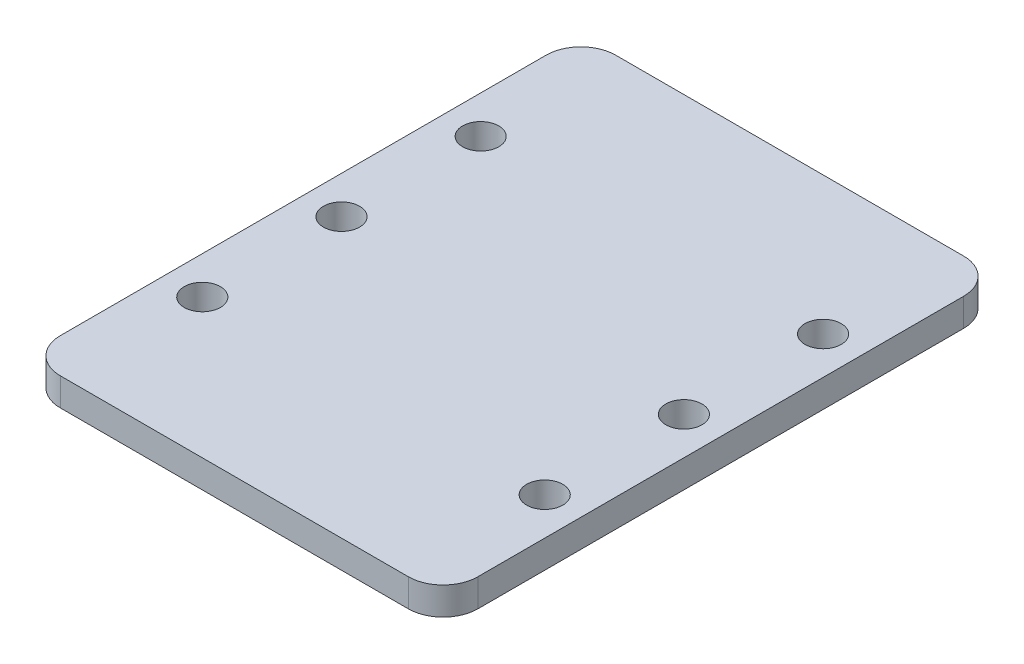
ISO-10303-21;
HEADER;
FILE_DESCRIPTION(('STEP AP214'),'2;1');
FILE_NAME('part.step','',(''),(''),'','','');
FILE_SCHEMA(('AUTOMOTIVE_DESIGN { 1 0 10303 214 1 1 1 1 }'));
ENDSEC;
DATA;
#1=APPLICATION_CONTEXT('core data for automotive mechanical design processes');
#2=APPLICATION_PROTOCOL_DEFINITION('international standard','automotive_design',2000,#1);
#3=PRODUCT_CONTEXT('',#1,'mechanical');
#4=PRODUCT('Part','Part','',(#3));
#5=PRODUCT_RELATED_PRODUCT_CATEGORY('part','',(#4));
#6=PRODUCT_DEFINITION_FORMATION('','',#4);
#7=PRODUCT_DEFINITION_CONTEXT('part definition',#1,'design');
#8=PRODUCT_DEFINITION('design','',#6,#7);
#9=PRODUCT_DEFINITION_SHAPE('','',#8);
#10=(LENGTH_UNIT() NAMED_UNIT(*) SI_UNIT(.MILLI.,.METRE.));
#11=(NAMED_UNIT(*) PLANE_ANGLE_UNIT() SI_UNIT($,.RADIAN.));
#12=(NAMED_UNIT(*) SI_UNIT($,.STERADIAN.) SOLID_ANGLE_UNIT());
#13=UNCERTAINTY_MEASURE_WITH_UNIT(LENGTH_MEASURE(1.E-05),#10,'distance_accuracy_value','');
#14=(GEOMETRIC_REPRESENTATION_CONTEXT(3) GLOBAL_UNCERTAINTY_ASSIGNED_CONTEXT((#13)) GLOBAL_UNIT_ASSIGNED_CONTEXT((#10,
#11,#12)) REPRESENTATION_CONTEXT('',''));
#15=CARTESIAN_POINT('',(0.,0.,0.));
#16=DIRECTION('',(0.,0.,1.));
#17=DIRECTION('',(1.,0.,0.));
#18=AXIS2_PLACEMENT_3D('',#15,#16,#17);
#19=CARTESIAN_POINT('',(0.,2.54,0.));
#20=DIRECTION('',(0.,-1.,0.));
#21=DIRECTION('',(0.,0.,-1.));
#22=AXIS2_PLACEMENT_3D('',#19,#20,#21);
#23=PLANE('',#22);
#24=DIRECTION('',(1.,0.,0.));
#25=VECTOR('',#24,1.);
#26=CARTESIAN_POINT('',(-76.2000000000001,2.54,-43.053));
#27=LINE('',#26,#25);
#28=CARTESIAN_POINT('',(-111.125,2.54,-43.053));
#29=VERTEX_POINT('',#28);
#30=CARTESIAN_POINT('',(-79.3750000000001,2.54,-43.053));
#31=VERTEX_POINT('',#30);
#32=EDGE_CURVE('E135',#29,#31,#27,.T.);
#33=ORIENTED_EDGE('',*,*,#32,.T.);
#34=CARTESIAN_POINT('',(-79.3750000000001,2.54,-46.228));
#35=DIRECTION('',(0.,-1.,0.));
#36=DIRECTION('',(0.,0.,-1.));
#37=AXIS2_PLACEMENT_3D('',#34,#35,#36);
#38=CIRCLE('',#37,3.175);
#39=CARTESIAN_POINT('',(-76.2000000000001,2.54,-46.228));
#40=VERTEX_POINT('',#39);
#41=EDGE_CURVE('E154',#31,#40,#38,.F.);
#42=ORIENTED_EDGE('',*,*,#41,.T.);
#43=DIRECTION('',(0.,0.,-1.));
#44=VECTOR('',#43,1.);
#45=CARTESIAN_POINT('',(-76.2000000000001,2.54,-93.726));
#46=LINE('',#45,#44);
#47=CARTESIAN_POINT('',(-76.2000000000001,2.54,-90.551));
#48=VERTEX_POINT('',#47);
#49=EDGE_CURVE('E118',#40,#48,#46,.T.);
#50=ORIENTED_EDGE('',*,*,#49,.T.);
#51=CARTESIAN_POINT('',(-79.3750000000001,2.54,-90.551));
#52=DIRECTION('',(0.,-1.,0.));
#53=DIRECTION('',(0.,0.,-1.));
#54=AXIS2_PLACEMENT_3D('',#51,#52,#53);
#55=CIRCLE('',#54,3.175);
#56=CARTESIAN_POINT('',(-79.3750000000001,2.54,-93.726));
#57=VERTEX_POINT('',#56);
#58=EDGE_CURVE('E152',#48,#57,#55,.F.);
#59=ORIENTED_EDGE('',*,*,#58,.T.);
#60=DIRECTION('',(-1.,0.,0.));
#61=VECTOR('',#60,1.);
#62=CARTESIAN_POINT('',(-76.2000000000001,2.54,-93.726));
#63=LINE('',#62,#61);
#64=CARTESIAN_POINT('',(-111.125,2.54,-93.726));
#65=VERTEX_POINT('',#64);
#66=EDGE_CURVE('E174',#57,#65,#63,.T.);
#67=ORIENTED_EDGE('',*,*,#66,.T.);
#68=CARTESIAN_POINT('',(-111.125,2.54,-90.551));
#69=DIRECTION('',(0.,-1.,0.));
#70=DIRECTION('',(0.,0.,-1.));
#71=AXIS2_PLACEMENT_3D('',#68,#69,#70);
#72=CIRCLE('',#71,3.175);
#73=CARTESIAN_POINT('',(-114.3,2.54,-90.551));
#74=VERTEX_POINT('',#73);
#75=EDGE_CURVE('E53',#65,#74,#72,.F.);
#76=ORIENTED_EDGE('',*,*,#75,.T.);
#77=DIRECTION('',(0.,0.,1.));
#78=VECTOR('',#77,1.);
#79=CARTESIAN_POINT('',(-114.3,2.54,-43.053));
#80=LINE('',#79,#78);
#81=CARTESIAN_POINT('',(-114.3,2.54,-46.228));
#82=VERTEX_POINT('',#81);
#83=EDGE_CURVE('E164',#74,#82,#80,.T.);
#84=ORIENTED_EDGE('',*,*,#83,.T.);
#85=CARTESIAN_POINT('',(-111.125,2.54,-46.228));
#86=DIRECTION('',(0.,-1.,0.));
#87=DIRECTION('',(0.,0.,-1.));
#88=AXIS2_PLACEMENT_3D('',#85,#86,#87);
#89=CIRCLE('',#88,3.175);
#90=EDGE_CURVE('E150',#82,#29,#89,.F.);
#91=ORIENTED_EDGE('',*,*,#90,.T.);
#92=EDGE_LOOP('',(#33,#42,#50,#59,#67,#76,#84,#91));
#93=FACE_BOUND('',#92,.T.);
#94=CARTESIAN_POINT('',(-110.871000000001,2.54,-81.1529999999999));
#95=DIRECTION('',(0.,1.,0.));
#96=DIRECTION('',(0.,0.,1.));
#97=AXIS2_PLACEMENT_3D('',#94,#95,#96);
#98=CIRCLE('',#97,1.65100000000001);
#99=CARTESIAN_POINT('',(-110.871000000001,2.54,-79.502));
#100=VERTEX_POINT('',#99);
#101=EDGE_CURVE('E126',#100,#100,#98,.T.);
#102=ORIENTED_EDGE('',*,*,#101,.F.);
#103=EDGE_LOOP('',(#102));
#104=FACE_BOUND('',#103,.T.);
#105=CARTESIAN_POINT('',(-110.871,2.54,-68.453));
#106=DIRECTION('',(0.,1.,0.));
#107=DIRECTION('',(0.,0.,1.));
#108=AXIS2_PLACEMENT_3D('',#105,#106,#107);
#109=CIRCLE('',#108,1.65100000000001);
#110=CARTESIAN_POINT('',(-110.871,2.54,-66.802));
#111=VERTEX_POINT('',#110);
#112=EDGE_CURVE('E179',#111,#111,#109,.T.);
#113=ORIENTED_EDGE('',*,*,#112,.F.);
#114=EDGE_LOOP('',(#113));
#115=FACE_BOUND('',#114,.T.);
#116=CARTESIAN_POINT('',(-110.871,2.54,-55.753));
#117=DIRECTION('',(0.,1.,0.));
#118=DIRECTION('',(0.,0.,1.));
#119=AXIS2_PLACEMENT_3D('',#116,#117,#118);
#120=CIRCLE('',#119,1.65100000000001);
#121=CARTESIAN_POINT('',(-110.871,2.54,-54.102));
#122=VERTEX_POINT('',#121);
#123=EDGE_CURVE('E184',#122,#122,#120,.T.);
#124=ORIENTED_EDGE('',*,*,#123,.F.);
#125=EDGE_LOOP('',(#124));
#126=FACE_BOUND('',#125,.T.);
#127=CARTESIAN_POINT('',(-79.6289999999997,2.54,-81.1529999999999));
#128=DIRECTION('',(0.,1.,0.));
#129=DIRECTION('',(0.,0.,-1.));
#130=AXIS2_PLACEMENT_3D('',#127,#128,#129);
#131=CIRCLE('',#130,1.65100000000001);
#132=CARTESIAN_POINT('',(-79.6289999999997,2.54,-82.8039999999999));
#133=VERTEX_POINT('',#132);
#134=EDGE_CURVE('E190',#133,#133,#131,.T.);
#135=ORIENTED_EDGE('',*,*,#134,.F.);
#136=EDGE_LOOP('',(#135));
#137=FACE_BOUND('',#136,.T.);
#138=CARTESIAN_POINT('',(-79.6289999999998,2.54,-68.453));
#139=DIRECTION('',(0.,1.,0.));
#140=DIRECTION('',(0.,0.,-1.));
#141=AXIS2_PLACEMENT_3D('',#138,#139,#140);
#142=CIRCLE('',#141,1.65100000000001);
#143=CARTESIAN_POINT('',(-79.6289999999998,2.54,-70.104));
#144=VERTEX_POINT('',#143);
#145=EDGE_CURVE('E196',#144,#144,#142,.T.);
#146=ORIENTED_EDGE('',*,*,#145,.F.);
#147=EDGE_LOOP('',(#146));
#148=FACE_BOUND('',#147,.T.);
#149=CARTESIAN_POINT('',(-79.629,2.54,-55.753));
#150=DIRECTION('',(0.,1.,0.));
#151=DIRECTION('',(0.,0.,-1.));
#152=AXIS2_PLACEMENT_3D('',#149,#150,#151);
#153=CIRCLE('',#152,1.65100000000001);
#154=CARTESIAN_POINT('',(-79.629,2.54,-57.404));
#155=VERTEX_POINT('',#154);
#156=EDGE_CURVE('E202',#155,#155,#153,.T.);
#157=ORIENTED_EDGE('',*,*,#156,.F.);
#158=EDGE_LOOP('',(#157));
#159=FACE_BOUND('',#158,.T.);
#160=ADVANCED_FACE('F33',(#93,#104,#115,#126,#137,#148,#159),#23,.F.);
#161=CARTESIAN_POINT('',(0.,0.,0.));
#162=DIRECTION('',(0.,-1.,0.));
#163=DIRECTION('',(0.,0.,-1.));
#164=AXIS2_PLACEMENT_3D('',#161,#162,#163);
#165=PLANE('',#164);
#166=CARTESIAN_POINT('',(-79.6289999999998,0.,-68.453));
#167=DIRECTION('',(0.,1.,0.));
#168=DIRECTION('',(0.,0.,-1.));
#169=AXIS2_PLACEMENT_3D('',#166,#167,#168);
#170=CIRCLE('',#169,1.65100000000001);
#171=CARTESIAN_POINT('',(-79.6289999999998,0.,-70.104));
#172=VERTEX_POINT('',#171);
#173=EDGE_CURVE('E199',#172,#172,#170,.T.);
#174=ORIENTED_EDGE('',*,*,#173,.T.);
#175=EDGE_LOOP('',(#174));
#176=FACE_BOUND('',#175,.T.);
#177=CARTESIAN_POINT('',(-110.871,0.,-55.753));
#178=DIRECTION('',(0.,1.,0.));
#179=DIRECTION('',(0.,0.,1.));
#180=AXIS2_PLACEMENT_3D('',#177,#178,#179);
#181=CIRCLE('',#180,1.65100000000001);
#182=CARTESIAN_POINT('',(-110.871,0.,-54.102));
#183=VERTEX_POINT('',#182);
#184=EDGE_CURVE('E187',#183,#183,#181,.T.);
#185=ORIENTED_EDGE('',*,*,#184,.T.);
#186=EDGE_LOOP('',(#185));
#187=FACE_BOUND('',#186,.T.);
#188=CARTESIAN_POINT('',(-110.871000000001,0.,-81.1529999999999));
#189=DIRECTION('',(0.,1.,0.));
#190=DIRECTION('',(0.,0.,1.));
#191=AXIS2_PLACEMENT_3D('',#188,#189,#190);
#192=CIRCLE('',#191,1.65100000000001);
#193=CARTESIAN_POINT('',(-110.871000000001,0.,-79.502));
#194=VERTEX_POINT('',#193);
#195=EDGE_CURVE('E132',#194,#194,#192,.T.);
#196=ORIENTED_EDGE('',*,*,#195,.T.);
#197=EDGE_LOOP('',(#196));
#198=FACE_BOUND('',#197,.T.);
#199=DIRECTION('',(0.,0.,-1.));
#200=VECTOR('',#199,1.);
#201=CARTESIAN_POINT('',(-76.2000000000001,0.,-93.726));
#202=LINE('',#201,#200);
#203=CARTESIAN_POINT('',(-76.2000000000001,0.,-46.228));
#204=VERTEX_POINT('',#203);
#205=CARTESIAN_POINT('',(-76.2000000000001,0.,-90.551));
#206=VERTEX_POINT('',#205);
#207=EDGE_CURVE('E115',#204,#206,#202,.T.);
#208=ORIENTED_EDGE('',*,*,#207,.F.);
#209=CARTESIAN_POINT('',(-79.3750000000001,0.,-46.228));
#210=DIRECTION('',(0.,-1.,0.));
#211=DIRECTION('',(0.,0.,-1.));
#212=AXIS2_PLACEMENT_3D('',#209,#210,#211);
#213=CIRCLE('',#212,3.175);
#214=CARTESIAN_POINT('',(-79.3750000000001,0.,-43.053));
#215=VERTEX_POINT('',#214);
#216=EDGE_CURVE('E98',#204,#215,#213,.T.);
#217=ORIENTED_EDGE('',*,*,#216,.T.);
#218=DIRECTION('',(1.,0.,0.));
#219=VECTOR('',#218,1.);
#220=CARTESIAN_POINT('',(-76.2000000000001,0.,-43.053));
#221=LINE('',#220,#219);
#222=CARTESIAN_POINT('',(-111.125,0.,-43.053));
#223=VERTEX_POINT('',#222);
#224=EDGE_CURVE('E139',#223,#215,#221,.T.);
#225=ORIENTED_EDGE('',*,*,#224,.F.);
#226=CARTESIAN_POINT('',(-111.125,0.,-46.228));
#227=DIRECTION('',(0.,-1.,0.));
#228=DIRECTION('',(0.,0.,-1.));
#229=AXIS2_PLACEMENT_3D('',#226,#227,#228);
#230=CIRCLE('',#229,3.175);
#231=CARTESIAN_POINT('',(-114.3,0.,-46.228));
#232=VERTEX_POINT('',#231);
#233=EDGE_CURVE('E143',#223,#232,#230,.T.);
#234=ORIENTED_EDGE('',*,*,#233,.T.);
#235=DIRECTION('',(0.,0.,1.));
#236=VECTOR('',#235,1.);
#237=CARTESIAN_POINT('',(-114.3,0.,-43.053));
#238=LINE('',#237,#236);
#239=CARTESIAN_POINT('',(-114.3,0.,-90.551));
#240=VERTEX_POINT('',#239);
#241=EDGE_CURVE('E129',#240,#232,#238,.T.);
#242=ORIENTED_EDGE('',*,*,#241,.F.);
#243=CARTESIAN_POINT('',(-111.125,0.,-90.551));
#244=DIRECTION('',(0.,-1.,0.));
#245=DIRECTION('',(0.,0.,-1.));
#246=AXIS2_PLACEMENT_3D('',#243,#244,#245);
#247=CIRCLE('',#246,3.175);
#248=CARTESIAN_POINT('',(-111.125,0.,-93.726));
#249=VERTEX_POINT('',#248);
#250=EDGE_CURVE('E119',#240,#249,#247,.T.);
#251=ORIENTED_EDGE('',*,*,#250,.T.);
#252=DIRECTION('',(-1.,0.,0.));
#253=VECTOR('',#252,1.);
#254=CARTESIAN_POINT('',(-76.2000000000001,0.,-93.726));
#255=LINE('',#254,#253);
#256=CARTESIAN_POINT('',(-79.3750000000001,0.,-93.726));
#257=VERTEX_POINT('',#256);
#258=EDGE_CURVE('E125',#257,#249,#255,.T.);
#259=ORIENTED_EDGE('',*,*,#258,.F.);
#260=CARTESIAN_POINT('',(-79.3750000000001,0.,-90.551));
#261=DIRECTION('',(0.,-1.,0.));
#262=DIRECTION('',(0.,0.,-1.));
#263=AXIS2_PLACEMENT_3D('',#260,#261,#262);
#264=CIRCLE('',#263,3.175);
#265=EDGE_CURVE('E109',#257,#206,#264,.T.);
#266=ORIENTED_EDGE('',*,*,#265,.T.);
#267=EDGE_LOOP('',(#208,#217,#225,#234,#242,#251,#259,#266));
#268=FACE_BOUND('',#267,.T.);
#269=CARTESIAN_POINT('',(-110.871,0.,-68.453));
#270=DIRECTION('',(0.,1.,0.));
#271=DIRECTION('',(0.,0.,1.));
#272=AXIS2_PLACEMENT_3D('',#269,#270,#271);
#273=CIRCLE('',#272,1.65100000000001);
#274=CARTESIAN_POINT('',(-110.871,0.,-66.802));
#275=VERTEX_POINT('',#274);
#276=EDGE_CURVE('E181',#275,#275,#273,.T.);
#277=ORIENTED_EDGE('',*,*,#276,.T.);
#278=EDGE_LOOP('',(#277));
#279=FACE_BOUND('',#278,.T.);
#280=CARTESIAN_POINT('',(-79.6289999999997,0.,-81.1529999999999));
#281=DIRECTION('',(0.,1.,0.));
#282=DIRECTION('',(0.,0.,-1.));
#283=AXIS2_PLACEMENT_3D('',#280,#281,#282);
#284=CIRCLE('',#283,1.65100000000001);
#285=CARTESIAN_POINT('',(-79.6289999999997,0.,-82.8039999999999));
#286=VERTEX_POINT('',#285);
#287=EDGE_CURVE('E193',#286,#286,#284,.T.);
#288=ORIENTED_EDGE('',*,*,#287,.T.);
#289=EDGE_LOOP('',(#288));
#290=FACE_BOUND('',#289,.T.);
#291=CARTESIAN_POINT('',(-79.629,0.,-55.753));
#292=DIRECTION('',(0.,1.,0.));
#293=DIRECTION('',(0.,0.,-1.));
#294=AXIS2_PLACEMENT_3D('',#291,#292,#293);
#295=CIRCLE('',#294,1.65100000000001);
#296=CARTESIAN_POINT('',(-79.629,0.,-57.404));
#297=VERTEX_POINT('',#296);
#298=EDGE_CURVE('E205',#297,#297,#295,.T.);
#299=ORIENTED_EDGE('',*,*,#298,.T.);
#300=EDGE_LOOP('',(#299));
#301=FACE_BOUND('',#300,.T.);
#302=ADVANCED_FACE('F122',(#176,#187,#198,#268,#279,#290,#301),#165,.T.);
#303=CARTESIAN_POINT('',(-76.2000000000001,2.54,-93.726));
#304=DIRECTION('',(-1.,0.,0.));
#305=DIRECTION('',(0.,0.,1.));
#306=AXIS2_PLACEMENT_3D('',#303,#304,#305);
#307=PLANE('',#306);
#308=ORIENTED_EDGE('',*,*,#49,.F.);
#309=DIRECTION('',(0.,-1.,0.));
#310=VECTOR('',#309,1.);
#311=CARTESIAN_POINT('',(-76.2000000000001,2.54,-46.228));
#312=LINE('',#311,#310);
#313=EDGE_CURVE('E102',#40,#204,#312,.T.);
#314=ORIENTED_EDGE('',*,*,#313,.T.);
#315=ORIENTED_EDGE('',*,*,#207,.T.);
#316=DIRECTION('',(0.,-1.,0.));
#317=VECTOR('',#316,1.);
#318=CARTESIAN_POINT('',(-76.2000000000001,2.54,-90.551));
#319=LINE('',#318,#317);
#320=EDGE_CURVE('E120',#206,#48,#319,.F.);
#321=ORIENTED_EDGE('',*,*,#320,.T.);
#322=EDGE_LOOP('',(#308,#314,#315,#321));
#323=FACE_BOUND('',#322,.T.);
#324=ADVANCED_FACE('F114',(#323),#307,.F.);
#325=CARTESIAN_POINT('',(-76.2000000000001,2.54,-93.726));
#326=DIRECTION('',(0.,0.,1.));
#327=DIRECTION('',(1.,0.,0.));
#328=AXIS2_PLACEMENT_3D('',#325,#326,#327);
#329=PLANE('',#328);
#330=ORIENTED_EDGE('',*,*,#66,.F.);
#331=DIRECTION('',(0.,-1.,0.));
#332=VECTOR('',#331,1.);
#333=CARTESIAN_POINT('',(-79.3750000000001,2.54,-93.726));
#334=LINE('',#333,#332);
#335=EDGE_CURVE('E158',#57,#257,#334,.T.);
#336=ORIENTED_EDGE('',*,*,#335,.T.);
#337=ORIENTED_EDGE('',*,*,#258,.T.);
#338=DIRECTION('',(0.,-1.,0.));
#339=VECTOR('',#338,1.);
#340=CARTESIAN_POINT('',(-111.125,2.54,-93.726));
#341=LINE('',#340,#339);
#342=EDGE_CURVE('E156',#249,#65,#341,.F.);
#343=ORIENTED_EDGE('',*,*,#342,.T.);
#344=EDGE_LOOP('',(#330,#336,#337,#343));
#345=FACE_BOUND('',#344,.T.);
#346=ADVANCED_FACE('F230',(#345),#329,.F.);
#347=CARTESIAN_POINT('',(-114.3,2.54,-43.053));
#348=DIRECTION('',(1.,0.,0.));
#349=DIRECTION('',(0.,0.,-1.));
#350=AXIS2_PLACEMENT_3D('',#347,#348,#349);
#351=PLANE('',#350);
#352=ORIENTED_EDGE('',*,*,#241,.T.);
#353=DIRECTION('',(0.,-1.,0.));
#354=VECTOR('',#353,1.);
#355=CARTESIAN_POINT('',(-114.3,2.54,-46.228));
#356=LINE('',#355,#354);
#357=EDGE_CURVE('E11',#232,#82,#356,.F.);
#358=ORIENTED_EDGE('',*,*,#357,.T.);
#359=ORIENTED_EDGE('',*,*,#83,.F.);
#360=DIRECTION('',(0.,-1.,0.));
#361=VECTOR('',#360,1.);
#362=CARTESIAN_POINT('',(-114.3,2.54,-90.551));
#363=LINE('',#362,#361);
#364=EDGE_CURVE('E41',#74,#240,#363,.T.);
#365=ORIENTED_EDGE('',*,*,#364,.T.);
#366=EDGE_LOOP('',(#352,#358,#359,#365));
#367=FACE_BOUND('',#366,.T.);
#368=ADVANCED_FACE('F163',(#367),#351,.F.);
#369=CARTESIAN_POINT('',(-76.2000000000001,2.54,-43.053));
#370=DIRECTION('',(0.,0.,-1.));
#371=DIRECTION('',(-1.,0.,0.));
#372=AXIS2_PLACEMENT_3D('',#369,#370,#371);
#373=PLANE('',#372);
#374=ORIENTED_EDGE('',*,*,#224,.T.);
#375=DIRECTION('',(0.,-1.,0.));
#376=VECTOR('',#375,1.);
#377=CARTESIAN_POINT('',(-79.3750000000001,2.54,-43.053));
#378=LINE('',#377,#376);
#379=EDGE_CURVE('E103',#215,#31,#378,.F.);
#380=ORIENTED_EDGE('',*,*,#379,.T.);
#381=ORIENTED_EDGE('',*,*,#32,.F.);
#382=DIRECTION('',(0.,-1.,0.));
#383=VECTOR('',#382,1.);
#384=CARTESIAN_POINT('',(-111.125,2.54,-43.053));
#385=LINE('',#384,#383);
#386=EDGE_CURVE('E108',#29,#223,#385,.T.);
#387=ORIENTED_EDGE('',*,*,#386,.T.);
#388=EDGE_LOOP('',(#374,#380,#381,#387));
#389=FACE_BOUND('',#388,.T.);
#390=ADVANCED_FACE('F172',(#389),#373,.F.);
#391=CARTESIAN_POINT('',(-110.871000000001,2.54,-81.1529999999999));
#392=DIRECTION('',(0.,-1.,0.));
#393=DIRECTION('',(0.,0.,-1.));
#394=AXIS2_PLACEMENT_3D('',#391,#392,#393);
#395=CYLINDRICAL_SURFACE('',#394,1.65100000000001);
#396=ORIENTED_EDGE('',*,*,#101,.T.);
#397=EDGE_LOOP('',(#396));
#398=FACE_BOUND('',#397,.T.);
#399=ORIENTED_EDGE('',*,*,#195,.F.);
#400=EDGE_LOOP('',(#399));
#401=FACE_BOUND('',#400,.T.);
#402=ADVANCED_FACE('F223',(#398,#401),#395,.F.);
#403=CARTESIAN_POINT('',(-110.871,2.54,-68.453));
#404=DIRECTION('',(0.,-1.,0.));
#405=DIRECTION('',(0.,0.,-1.));
#406=AXIS2_PLACEMENT_3D('',#403,#404,#405);
#407=CYLINDRICAL_SURFACE('',#406,1.65100000000001);
#408=ORIENTED_EDGE('',*,*,#112,.T.);
#409=EDGE_LOOP('',(#408));
#410=FACE_BOUND('',#409,.T.);
#411=ORIENTED_EDGE('',*,*,#276,.F.);
#412=EDGE_LOOP('',(#411));
#413=FACE_BOUND('',#412,.T.);
#414=ADVANCED_FACE('F341',(#410,#413),#407,.F.);
#415=CARTESIAN_POINT('',(-110.871,2.54,-55.753));
#416=DIRECTION('',(0.,-1.,0.));
#417=DIRECTION('',(0.,0.,-1.));
#418=AXIS2_PLACEMENT_3D('',#415,#416,#417);
#419=CYLINDRICAL_SURFACE('',#418,1.65100000000001);
#420=ORIENTED_EDGE('',*,*,#123,.T.);
#421=EDGE_LOOP('',(#420));
#422=FACE_BOUND('',#421,.T.);
#423=ORIENTED_EDGE('',*,*,#184,.F.);
#424=EDGE_LOOP('',(#423));
#425=FACE_BOUND('',#424,.T.);
#426=ADVANCED_FACE('F331',(#422,#425),#419,.F.);
#427=CARTESIAN_POINT('',(-79.6289999999997,2.54,-81.1529999999999));
#428=DIRECTION('',(0.,-1.,0.));
#429=DIRECTION('',(0.,0.,-1.));
#430=AXIS2_PLACEMENT_3D('',#427,#428,#429);
#431=CYLINDRICAL_SURFACE('',#430,1.65100000000001);
#432=ORIENTED_EDGE('',*,*,#134,.T.);
#433=EDGE_LOOP('',(#432));
#434=FACE_BOUND('',#433,.T.);
#435=ORIENTED_EDGE('',*,*,#287,.F.);
#436=EDGE_LOOP('',(#435));
#437=FACE_BOUND('',#436,.T.);
#438=ADVANCED_FACE('F321',(#434,#437),#431,.F.);
#439=CARTESIAN_POINT('',(-79.6289999999998,2.54,-68.453));
#440=DIRECTION('',(0.,-1.,0.));
#441=DIRECTION('',(0.,0.,-1.));
#442=AXIS2_PLACEMENT_3D('',#439,#440,#441);
#443=CYLINDRICAL_SURFACE('',#442,1.65100000000001);
#444=ORIENTED_EDGE('',*,*,#145,.T.);
#445=EDGE_LOOP('',(#444));
#446=FACE_BOUND('',#445,.T.);
#447=ORIENTED_EDGE('',*,*,#173,.F.);
#448=EDGE_LOOP('',(#447));
#449=FACE_BOUND('',#448,.T.);
#450=ADVANCED_FACE('F312',(#446,#449),#443,.F.);
#451=CARTESIAN_POINT('',(-79.629,2.54,-55.753));
#452=DIRECTION('',(0.,-1.,0.));
#453=DIRECTION('',(0.,0.,-1.));
#454=AXIS2_PLACEMENT_3D('',#451,#452,#453);
#455=CYLINDRICAL_SURFACE('',#454,1.65100000000001);
#456=ORIENTED_EDGE('',*,*,#156,.T.);
#457=EDGE_LOOP('',(#456));
#458=FACE_BOUND('',#457,.T.);
#459=ORIENTED_EDGE('',*,*,#298,.F.);
#460=EDGE_LOOP('',(#459));
#461=FACE_BOUND('',#460,.T.);
#462=ADVANCED_FACE('F211',(#458,#461),#455,.F.);
#463=CARTESIAN_POINT('',(-79.3750000000001,2.54,-46.228));
#464=DIRECTION('',(0.,-1.,0.));
#465=DIRECTION('',(0.,0.,-1.));
#466=AXIS2_PLACEMENT_3D('',#463,#464,#465);
#467=CYLINDRICAL_SURFACE('',#466,3.175);
#468=ORIENTED_EDGE('',*,*,#41,.F.);
#469=ORIENTED_EDGE('',*,*,#379,.F.);
#470=ORIENTED_EDGE('',*,*,#216,.F.);
#471=ORIENTED_EDGE('',*,*,#313,.F.);
#472=EDGE_LOOP('',(#468,#469,#470,#471));
#473=FACE_BOUND('',#472,.T.);
#474=ADVANCED_FACE('F101',(#473),#467,.T.);
#475=CARTESIAN_POINT('',(-79.3750000000001,2.54,-90.551));
#476=DIRECTION('',(0.,-1.,0.));
#477=DIRECTION('',(0.,0.,-1.));
#478=AXIS2_PLACEMENT_3D('',#475,#476,#477);
#479=CYLINDRICAL_SURFACE('',#478,3.175);
#480=ORIENTED_EDGE('',*,*,#58,.F.);
#481=ORIENTED_EDGE('',*,*,#320,.F.);
#482=ORIENTED_EDGE('',*,*,#265,.F.);
#483=ORIENTED_EDGE('',*,*,#335,.F.);
#484=EDGE_LOOP('',(#480,#481,#482,#483));
#485=FACE_BOUND('',#484,.T.);
#486=ADVANCED_FACE('F238',(#485),#479,.T.);
#487=CARTESIAN_POINT('',(-111.125,2.54,-46.228));
#488=DIRECTION('',(0.,-1.,0.));
#489=DIRECTION('',(0.,0.,-1.));
#490=AXIS2_PLACEMENT_3D('',#487,#488,#489);
#491=CYLINDRICAL_SURFACE('',#490,3.175);
#492=ORIENTED_EDGE('',*,*,#90,.F.);
#493=ORIENTED_EDGE('',*,*,#357,.F.);
#494=ORIENTED_EDGE('',*,*,#233,.F.);
#495=ORIENTED_EDGE('',*,*,#386,.F.);
#496=EDGE_LOOP('',(#492,#493,#494,#495));
#497=FACE_BOUND('',#496,.T.);
#498=ADVANCED_FACE('F169',(#497),#491,.T.);
#499=CARTESIAN_POINT('',(-111.125,2.54,-90.551));
#500=DIRECTION('',(0.,-1.,0.));
#501=DIRECTION('',(0.,0.,-1.));
#502=AXIS2_PLACEMENT_3D('',#499,#500,#501);
#503=CYLINDRICAL_SURFACE('',#502,3.175);
#504=ORIENTED_EDGE('',*,*,#75,.F.);
#505=ORIENTED_EDGE('',*,*,#342,.F.);
#506=ORIENTED_EDGE('',*,*,#250,.F.);
#507=ORIENTED_EDGE('',*,*,#364,.F.);
#508=EDGE_LOOP('',(#504,#505,#506,#507));
#509=FACE_BOUND('',#508,.T.);
#510=ADVANCED_FACE('F35',(#509),#503,.T.);
#511=CLOSED_SHELL('',(#160,#302,#324,#346,#368,#390,#402,#414,#426,#438,#450,#462,#474,#486,
#498,#510));
#512=MANIFOLD_SOLID_BREP('B2',#511);
#513=ADVANCED_BREP_SHAPE_REPRESENTATION('',(#18,#512),#14);
#514=SHAPE_DEFINITION_REPRESENTATION(#9,#513);
ENDSEC;
END-ISO-10303-21;
